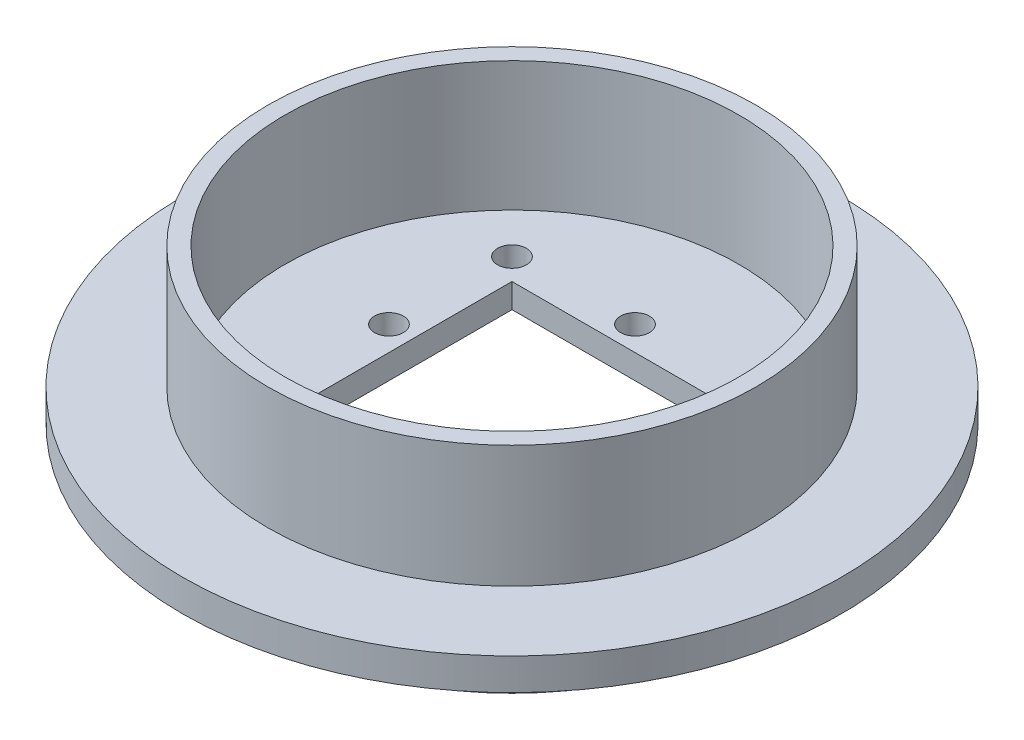
ISO-10303-21;
HEADER;
FILE_DESCRIPTION(('STEP AP214'),'2;1');
FILE_NAME('part.step','',(''),(''),'','','');
FILE_SCHEMA(('AUTOMOTIVE_DESIGN { 1 0 10303 214 1 1 1 1 }'));
ENDSEC;
DATA;
#1=APPLICATION_CONTEXT('core data for automotive mechanical design processes');
#2=APPLICATION_PROTOCOL_DEFINITION('international standard','automotive_design',2000,#1);
#3=PRODUCT_CONTEXT('',#1,'mechanical');
#4=PRODUCT('Part','Part','',(#3));
#5=PRODUCT_RELATED_PRODUCT_CATEGORY('part','',(#4));
#6=PRODUCT_DEFINITION_FORMATION('','',#4);
#7=PRODUCT_DEFINITION_CONTEXT('part definition',#1,'design');
#8=PRODUCT_DEFINITION('design','',#6,#7);
#9=PRODUCT_DEFINITION_SHAPE('','',#8);
#10=(LENGTH_UNIT() NAMED_UNIT(*) SI_UNIT(.MILLI.,.METRE.));
#11=(NAMED_UNIT(*) PLANE_ANGLE_UNIT() SI_UNIT($,.RADIAN.));
#12=(NAMED_UNIT(*) SI_UNIT($,.STERADIAN.) SOLID_ANGLE_UNIT());
#13=UNCERTAINTY_MEASURE_WITH_UNIT(LENGTH_MEASURE(1.E-05),#10,'distance_accuracy_value','');
#14=(GEOMETRIC_REPRESENTATION_CONTEXT(3) GLOBAL_UNCERTAINTY_ASSIGNED_CONTEXT((#13)) GLOBAL_UNIT_ASSIGNED_CONTEXT((#10,
#11,#12)) REPRESENTATION_CONTEXT('',''));
#15=CARTESIAN_POINT('',(0.,0.,0.));
#16=DIRECTION('',(0.,0.,1.));
#17=DIRECTION('',(1.,0.,0.));
#18=AXIS2_PLACEMENT_3D('',#15,#16,#17);
#19=CARTESIAN_POINT('',(-20.2,-6.,20.2));
#20=DIRECTION('',(-1.,0.,0.));
#21=DIRECTION('',(0.,0.,1.));
#22=AXIS2_PLACEMENT_3D('',#19,#20,#21);
#23=PLANE('',#22);
#24=DIRECTION('',(0.,0.,-1.));
#25=VECTOR('',#24,1.);
#26=CARTESIAN_POINT('',(-20.2,-1.,20.2));
#27=LINE('',#26,#25);
#28=CARTESIAN_POINT('',(-20.2,-1.,20.2));
#29=VERTEX_POINT('',#28);
#30=CARTESIAN_POINT('',(-20.2,-1.,-20.2));
#31=VERTEX_POINT('',#30);
#32=EDGE_CURVE('E102',#29,#31,#27,.T.);
#33=ORIENTED_EDGE('',*,*,#32,.F.);
#34=DIRECTION('',(0.,1.,0.));
#35=VECTOR('',#34,1.);
#36=CARTESIAN_POINT('',(-20.2,-6.,20.2));
#37=LINE('',#36,#35);
#38=CARTESIAN_POINT('',(-20.2,-6.,20.2));
#39=VERTEX_POINT('',#38);
#40=EDGE_CURVE('E100',#39,#29,#37,.T.);
#41=ORIENTED_EDGE('',*,*,#40,.F.);
#42=DIRECTION('',(0.,0.,-1.));
#43=VECTOR('',#42,1.);
#44=CARTESIAN_POINT('',(-20.2,-5.99999999999999,20.2));
#45=LINE('',#44,#43);
#46=CARTESIAN_POINT('',(-20.2,-6.,-20.2));
#47=VERTEX_POINT('',#46);
#48=EDGE_CURVE('E52',#39,#47,#45,.T.);
#49=ORIENTED_EDGE('',*,*,#48,.T.);
#50=DIRECTION('',(0.,1.,0.));
#51=VECTOR('',#50,1.);
#52=CARTESIAN_POINT('',(-20.2,-6.,-20.2));
#53=LINE('',#52,#51);
#54=EDGE_CURVE('E114',#47,#31,#53,.T.);
#55=ORIENTED_EDGE('',*,*,#54,.T.);
#56=EDGE_LOOP('',(#33,#41,#49,#55));
#57=FACE_BOUND('',#56,.T.);
#58=ADVANCED_FACE('F42',(#57),#23,.F.);
#59=CARTESIAN_POINT('',(-20.2,-6.,20.2));
#60=DIRECTION('',(0.,0.,1.));
#61=DIRECTION('',(1.,0.,0.));
#62=AXIS2_PLACEMENT_3D('',#59,#60,#61);
#63=PLANE('',#62);
#64=DIRECTION('',(-1.,0.,0.));
#65=VECTOR('',#64,1.);
#66=CARTESIAN_POINT('',(-20.2,-1.,20.2));
#67=LINE('',#66,#65);
#68=CARTESIAN_POINT('',(20.2,-1.,20.2));
#69=VERTEX_POINT('',#68);
#70=EDGE_CURVE('E85',#69,#29,#67,.T.);
#71=ORIENTED_EDGE('',*,*,#70,.F.);
#72=DIRECTION('',(0.,1.,0.));
#73=VECTOR('',#72,1.);
#74=CARTESIAN_POINT('',(20.2,-6.,20.2));
#75=LINE('',#74,#73);
#76=CARTESIAN_POINT('',(20.2,-6.,20.2));
#77=VERTEX_POINT('',#76);
#78=EDGE_CURVE('E98',#77,#69,#75,.T.);
#79=ORIENTED_EDGE('',*,*,#78,.F.);
#80=DIRECTION('',(-1.,0.,0.));
#81=VECTOR('',#80,1.);
#82=CARTESIAN_POINT('',(-20.2,-5.99999999999999,20.2));
#83=LINE('',#82,#81);
#84=EDGE_CURVE('E135',#77,#39,#83,.T.);
#85=ORIENTED_EDGE('',*,*,#84,.T.);
#86=ORIENTED_EDGE('',*,*,#40,.T.);
#87=EDGE_LOOP('',(#71,#79,#85,#86));
#88=FACE_BOUND('',#87,.T.);
#89=ADVANCED_FACE('F97',(#88),#63,.F.);
#90=CARTESIAN_POINT('',(-20.2,-6.,-20.2));
#91=DIRECTION('',(0.,0.,-1.));
#92=DIRECTION('',(-1.,0.,0.));
#93=AXIS2_PLACEMENT_3D('',#90,#91,#92);
#94=PLANE('',#93);
#95=DIRECTION('',(1.,0.,0.));
#96=VECTOR('',#95,1.);
#97=CARTESIAN_POINT('',(-20.2,-1.,-20.2));
#98=LINE('',#97,#96);
#99=CARTESIAN_POINT('',(20.2,-1.,-20.2));
#100=VERTEX_POINT('',#99);
#101=EDGE_CURVE('E59',#31,#100,#98,.T.);
#102=ORIENTED_EDGE('',*,*,#101,.F.);
#103=ORIENTED_EDGE('',*,*,#54,.F.);
#104=DIRECTION('',(1.,0.,0.));
#105=VECTOR('',#104,1.);
#106=CARTESIAN_POINT('',(-20.2,-5.99999999999999,-20.2));
#107=LINE('',#106,#105);
#108=CARTESIAN_POINT('',(20.2,-6.,-20.2));
#109=VERTEX_POINT('',#108);
#110=EDGE_CURVE('E132',#47,#109,#107,.T.);
#111=ORIENTED_EDGE('',*,*,#110,.T.);
#112=DIRECTION('',(0.,1.,0.));
#113=VECTOR('',#112,1.);
#114=CARTESIAN_POINT('',(20.2,-6.,-20.2));
#115=LINE('',#114,#113);
#116=EDGE_CURVE('E123',#109,#100,#115,.T.);
#117=ORIENTED_EDGE('',*,*,#116,.T.);
#118=EDGE_LOOP('',(#102,#103,#111,#117));
#119=FACE_BOUND('',#118,.T.);
#120=ADVANCED_FACE('F144',(#119),#94,.F.);
#121=CARTESIAN_POINT('',(20.2,-6.,20.2));
#122=DIRECTION('',(1.,0.,0.));
#123=DIRECTION('',(0.,0.,-1.));
#124=AXIS2_PLACEMENT_3D('',#121,#122,#123);
#125=PLANE('',#124);
#126=DIRECTION('',(0.,0.,1.));
#127=VECTOR('',#126,1.);
#128=CARTESIAN_POINT('',(20.2,-1.,20.2));
#129=LINE('',#128,#127);
#130=EDGE_CURVE('E82',#100,#69,#129,.T.);
#131=ORIENTED_EDGE('',*,*,#130,.F.);
#132=ORIENTED_EDGE('',*,*,#116,.F.);
#133=DIRECTION('',(0.,0.,1.));
#134=VECTOR('',#133,1.);
#135=CARTESIAN_POINT('',(20.2,-6.,20.2));
#136=LINE('',#135,#134);
#137=EDGE_CURVE('E106',#109,#77,#136,.T.);
#138=ORIENTED_EDGE('',*,*,#137,.T.);
#139=ORIENTED_EDGE('',*,*,#78,.T.);
#140=EDGE_LOOP('',(#131,#132,#138,#139));
#141=FACE_BOUND('',#140,.T.);
#142=ADVANCED_FACE('F104',(#141),#125,.F.);
#143=CARTESIAN_POINT('',(-24.6194173824159,-6.,-24.6194173824159));
#144=DIRECTION('',(0.,1.,0.));
#145=DIRECTION('',(0.,0.,1.));
#146=AXIS2_PLACEMENT_3D('',#143,#144,#145);
#147=CYLINDRICAL_SURFACE('',#146,2.95);
#148=CARTESIAN_POINT('',(-24.6194173824159,-6.,-24.6194173824159));
#149=DIRECTION('',(0.,1.,0.));
#150=DIRECTION('',(0.,0.,1.));
#151=AXIS2_PLACEMENT_3D('',#148,#149,#150);
#152=CIRCLE('',#151,2.95);
#153=CARTESIAN_POINT('',(-24.6194173824159,-6.,-21.6694173824159));
#154=VERTEX_POINT('',#153);
#155=EDGE_CURVE('E188',#154,#154,#152,.T.);
#156=ORIENTED_EDGE('',*,*,#155,.F.);
#157=EDGE_LOOP('',(#156));
#158=FACE_BOUND('',#157,.T.);
#159=CARTESIAN_POINT('',(-24.6194173824159,-1.,-24.6194173824159));
#160=DIRECTION('',(0.,1.,0.));
#161=DIRECTION('',(0.,0.,1.));
#162=AXIS2_PLACEMENT_3D('',#159,#160,#161);
#163=CIRCLE('',#162,2.95);
#164=CARTESIAN_POINT('',(-24.6194173824159,-1.,-21.6694173824159));
#165=VERTEX_POINT('',#164);
#166=EDGE_CURVE('E92',#165,#165,#163,.F.);
#167=ORIENTED_EDGE('',*,*,#166,.F.);
#168=EDGE_LOOP('',(#167));
#169=FACE_BOUND('',#168,.T.);
#170=ADVANCED_FACE('F235',(#158,#169),#147,.F.);
#171=CARTESIAN_POINT('',(-25.2,-6.,0.));
#172=DIRECTION('',(0.,1.,0.));
#173=DIRECTION('',(0.,0.,1.));
#174=AXIS2_PLACEMENT_3D('',#171,#172,#173);
#175=CYLINDRICAL_SURFACE('',#174,2.95);
#176=CARTESIAN_POINT('',(-25.2,-6.,0.));
#177=DIRECTION('',(0.,1.,0.));
#178=DIRECTION('',(0.,0.,1.));
#179=AXIS2_PLACEMENT_3D('',#176,#177,#178);
#180=CIRCLE('',#179,2.95);
#181=CARTESIAN_POINT('',(-25.2,-6.,2.95));
#182=VERTEX_POINT('',#181);
#183=EDGE_CURVE('E160',#182,#182,#180,.T.);
#184=ORIENTED_EDGE('',*,*,#183,.F.);
#185=EDGE_LOOP('',(#184));
#186=FACE_BOUND('',#185,.T.);
#187=CARTESIAN_POINT('',(-25.2,-1.,0.));
#188=DIRECTION('',(0.,1.,0.));
#189=DIRECTION('',(0.,0.,1.));
#190=AXIS2_PLACEMENT_3D('',#187,#188,#189);
#191=CIRCLE('',#190,2.95);
#192=CARTESIAN_POINT('',(-25.2,-1.,2.95));
#193=VERTEX_POINT('',#192);
#194=EDGE_CURVE('E297',#193,#193,#191,.F.);
#195=ORIENTED_EDGE('',*,*,#194,.F.);
#196=EDGE_LOOP('',(#195));
#197=FACE_BOUND('',#196,.T.);
#198=ADVANCED_FACE('F239',(#186,#197),#175,.F.);
#199=CARTESIAN_POINT('',(0.,-6.,-25.2));
#200=DIRECTION('',(0.,1.,0.));
#201=DIRECTION('',(0.,0.,1.));
#202=AXIS2_PLACEMENT_3D('',#199,#200,#201);
#203=CYLINDRICAL_SURFACE('',#202,2.95);
#204=CARTESIAN_POINT('',(0.,-6.,-25.2));
#205=DIRECTION('',(0.,1.,0.));
#206=DIRECTION('',(0.,0.,1.));
#207=AXIS2_PLACEMENT_3D('',#204,#205,#206);
#208=CIRCLE('',#207,2.95);
#209=CARTESIAN_POINT('',(0.,-6.,-22.25));
#210=VERTEX_POINT('',#209);
#211=EDGE_CURVE('E169',#210,#210,#208,.T.);
#212=ORIENTED_EDGE('',*,*,#211,.F.);
#213=EDGE_LOOP('',(#212));
#214=FACE_BOUND('',#213,.T.);
#215=CARTESIAN_POINT('',(0.,-1.,-25.2));
#216=DIRECTION('',(0.,1.,0.));
#217=DIRECTION('',(0.,0.,1.));
#218=AXIS2_PLACEMENT_3D('',#215,#216,#217);
#219=CIRCLE('',#218,2.95);
#220=CARTESIAN_POINT('',(0.,-1.,-22.25));
#221=VERTEX_POINT('',#220);
#222=EDGE_CURVE('E293',#221,#221,#219,.F.);
#223=ORIENTED_EDGE('',*,*,#222,.F.);
#224=EDGE_LOOP('',(#223));
#225=FACE_BOUND('',#224,.T.);
#226=ADVANCED_FACE('F245',(#214,#225),#203,.F.);
#227=CARTESIAN_POINT('',(0.,-6.,25.2));
#228=DIRECTION('',(0.,1.,0.));
#229=DIRECTION('',(0.,0.,1.));
#230=AXIS2_PLACEMENT_3D('',#227,#228,#229);
#231=CYLINDRICAL_SURFACE('',#230,2.95);
#232=CARTESIAN_POINT('',(0.,-6.,25.2));
#233=DIRECTION('',(0.,1.,0.));
#234=DIRECTION('',(0.,0.,1.));
#235=AXIS2_PLACEMENT_3D('',#232,#233,#234);
#236=CIRCLE('',#235,2.95);
#237=CARTESIAN_POINT('',(0.,-6.,28.15));
#238=VERTEX_POINT('',#237);
#239=EDGE_CURVE('E164',#238,#238,#236,.T.);
#240=ORIENTED_EDGE('',*,*,#239,.F.);
#241=EDGE_LOOP('',(#240));
#242=FACE_BOUND('',#241,.T.);
#243=CARTESIAN_POINT('',(0.,-1.,25.2));
#244=DIRECTION('',(0.,1.,0.));
#245=DIRECTION('',(0.,0.,1.));
#246=AXIS2_PLACEMENT_3D('',#243,#244,#245);
#247=CIRCLE('',#246,2.95);
#248=CARTESIAN_POINT('',(0.,-1.,28.15));
#249=VERTEX_POINT('',#248);
#250=EDGE_CURVE('E289',#249,#249,#247,.F.);
#251=ORIENTED_EDGE('',*,*,#250,.F.);
#252=EDGE_LOOP('',(#251));
#253=FACE_BOUND('',#252,.T.);
#254=ADVANCED_FACE('F336',(#242,#253),#231,.F.);
#255=CARTESIAN_POINT('',(24.6194173824159,-6.,-24.6194173824159));
#256=DIRECTION('',(0.,1.,0.));
#257=DIRECTION('',(0.,0.,1.));
#258=AXIS2_PLACEMENT_3D('',#255,#256,#257);
#259=CYLINDRICAL_SURFACE('',#258,2.95);
#260=CARTESIAN_POINT('',(24.6194173824159,-6.,-24.6194173824159));
#261=DIRECTION('',(0.,1.,0.));
#262=DIRECTION('',(0.,0.,1.));
#263=AXIS2_PLACEMENT_3D('',#260,#261,#262);
#264=CIRCLE('',#263,2.95);
#265=CARTESIAN_POINT('',(24.6194173824159,-6.,-21.6694173824159));
#266=VERTEX_POINT('',#265);
#267=EDGE_CURVE('E184',#266,#266,#264,.T.);
#268=ORIENTED_EDGE('',*,*,#267,.F.);
#269=EDGE_LOOP('',(#268));
#270=FACE_BOUND('',#269,.T.);
#271=CARTESIAN_POINT('',(24.6194173824159,-1.,-24.6194173824159));
#272=DIRECTION('',(0.,1.,0.));
#273=DIRECTION('',(0.,0.,1.));
#274=AXIS2_PLACEMENT_3D('',#271,#272,#273);
#275=CIRCLE('',#274,2.95);
#276=CARTESIAN_POINT('',(24.6194173824159,-1.,-21.6694173824159));
#277=VERTEX_POINT('',#276);
#278=EDGE_CURVE('E285',#277,#277,#275,.F.);
#279=ORIENTED_EDGE('',*,*,#278,.F.);
#280=EDGE_LOOP('',(#279));
#281=FACE_BOUND('',#280,.T.);
#282=ADVANCED_FACE('F334',(#270,#281),#259,.F.);
#283=CARTESIAN_POINT('',(-24.6194173824159,-6.,24.6194173824159));
#284=DIRECTION('',(0.,1.,0.));
#285=DIRECTION('',(0.,0.,1.));
#286=AXIS2_PLACEMENT_3D('',#283,#284,#285);
#287=CYLINDRICAL_SURFACE('',#286,2.95);
#288=CARTESIAN_POINT('',(-24.6194173824159,-6.,24.6194173824159));
#289=DIRECTION('',(0.,1.,0.));
#290=DIRECTION('',(0.,0.,1.));
#291=AXIS2_PLACEMENT_3D('',#288,#289,#290);
#292=CIRCLE('',#291,2.95);
#293=CARTESIAN_POINT('',(-24.6194173824159,-6.,27.5694173824159));
#294=VERTEX_POINT('',#293);
#295=EDGE_CURVE('E180',#294,#294,#292,.T.);
#296=ORIENTED_EDGE('',*,*,#295,.F.);
#297=EDGE_LOOP('',(#296));
#298=FACE_BOUND('',#297,.T.);
#299=CARTESIAN_POINT('',(-24.6194173824159,-1.,24.6194173824159));
#300=DIRECTION('',(0.,1.,0.));
#301=DIRECTION('',(0.,0.,1.));
#302=AXIS2_PLACEMENT_3D('',#299,#300,#301);
#303=CIRCLE('',#302,2.95);
#304=CARTESIAN_POINT('',(-24.6194173824159,-1.,27.5694173824159));
#305=VERTEX_POINT('',#304);
#306=EDGE_CURVE('E281',#305,#305,#303,.F.);
#307=ORIENTED_EDGE('',*,*,#306,.F.);
#308=EDGE_LOOP('',(#307));
#309=FACE_BOUND('',#308,.T.);
#310=ADVANCED_FACE('F252',(#298,#309),#287,.F.);
#311=CARTESIAN_POINT('',(24.6194173824159,-6.,24.6194173824159));
#312=DIRECTION('',(0.,1.,0.));
#313=DIRECTION('',(0.,0.,1.));
#314=AXIS2_PLACEMENT_3D('',#311,#312,#313);
#315=CYLINDRICAL_SURFACE('',#314,2.95);
#316=CARTESIAN_POINT('',(24.6194173824159,-6.,24.6194173824159));
#317=DIRECTION('',(0.,1.,0.));
#318=DIRECTION('',(0.,0.,1.));
#319=AXIS2_PLACEMENT_3D('',#316,#317,#318);
#320=CIRCLE('',#319,2.95);
#321=CARTESIAN_POINT('',(24.6194173824159,-6.,27.5694173824159));
#322=VERTEX_POINT('',#321);
#323=EDGE_CURVE('E176',#322,#322,#320,.T.);
#324=ORIENTED_EDGE('',*,*,#323,.F.);
#325=EDGE_LOOP('',(#324));
#326=FACE_BOUND('',#325,.T.);
#327=CARTESIAN_POINT('',(24.6194173824159,-1.,24.6194173824159));
#328=DIRECTION('',(0.,1.,0.));
#329=DIRECTION('',(0.,0.,1.));
#330=AXIS2_PLACEMENT_3D('',#327,#328,#329);
#331=CIRCLE('',#330,2.95);
#332=CARTESIAN_POINT('',(24.6194173824159,-1.,27.5694173824159));
#333=VERTEX_POINT('',#332);
#334=EDGE_CURVE('E276',#333,#333,#331,.F.);
#335=ORIENTED_EDGE('',*,*,#334,.F.);
#336=EDGE_LOOP('',(#335));
#337=FACE_BOUND('',#336,.T.);
#338=ADVANCED_FACE('F324',(#326,#337),#315,.F.);
#339=CARTESIAN_POINT('',(25.2,-6.,0.));
#340=DIRECTION('',(0.,1.,0.));
#341=DIRECTION('',(0.,0.,1.));
#342=AXIS2_PLACEMENT_3D('',#339,#340,#341);
#343=CYLINDRICAL_SURFACE('',#342,2.95);
#344=CARTESIAN_POINT('',(25.2,-6.,0.));
#345=DIRECTION('',(0.,1.,0.));
#346=DIRECTION('',(0.,0.,1.));
#347=AXIS2_PLACEMENT_3D('',#344,#345,#346);
#348=CIRCLE('',#347,2.95);
#349=CARTESIAN_POINT('',(25.2,-6.,2.95));
#350=VERTEX_POINT('',#349);
#351=EDGE_CURVE('E168',#350,#350,#348,.T.);
#352=ORIENTED_EDGE('',*,*,#351,.F.);
#353=EDGE_LOOP('',(#352));
#354=FACE_BOUND('',#353,.T.);
#355=CARTESIAN_POINT('',(25.2,-1.,0.));
#356=DIRECTION('',(0.,1.,0.));
#357=DIRECTION('',(0.,0.,1.));
#358=AXIS2_PLACEMENT_3D('',#355,#356,#357);
#359=CIRCLE('',#358,2.95);
#360=CARTESIAN_POINT('',(25.2,-1.,2.95));
#361=VERTEX_POINT('',#360);
#362=EDGE_CURVE('E46',#361,#361,#359,.F.);
#363=ORIENTED_EDGE('',*,*,#362,.F.);
#364=EDGE_LOOP('',(#363));
#365=FACE_BOUND('',#364,.T.);
#366=ADVANCED_FACE('F322',(#354,#365),#343,.F.);
#367=CARTESIAN_POINT('',(0.,-6.,0.));
#368=DIRECTION('',(0.,-1.,0.));
#369=DIRECTION('',(0.,0.,-1.));
#370=AXIS2_PLACEMENT_3D('',#367,#368,#369);
#371=PLANE('',#370);
#372=ORIENTED_EDGE('',*,*,#84,.F.);
#373=ORIENTED_EDGE('',*,*,#137,.F.);
#374=ORIENTED_EDGE('',*,*,#110,.F.);
#375=ORIENTED_EDGE('',*,*,#48,.F.);
#376=EDGE_LOOP('',(#372,#373,#374,#375));
#377=FACE_BOUND('',#376,.T.);
#378=ORIENTED_EDGE('',*,*,#155,.T.);
#379=EDGE_LOOP('',(#378));
#380=FACE_BOUND('',#379,.T.);
#381=ORIENTED_EDGE('',*,*,#183,.T.);
#382=EDGE_LOOP('',(#381));
#383=FACE_BOUND('',#382,.T.);
#384=ORIENTED_EDGE('',*,*,#211,.T.);
#385=EDGE_LOOP('',(#384));
#386=FACE_BOUND('',#385,.T.);
#387=ORIENTED_EDGE('',*,*,#239,.T.);
#388=EDGE_LOOP('',(#387));
#389=FACE_BOUND('',#388,.T.);
#390=ORIENTED_EDGE('',*,*,#267,.T.);
#391=EDGE_LOOP('',(#390));
#392=FACE_BOUND('',#391,.T.);
#393=ORIENTED_EDGE('',*,*,#295,.T.);
#394=EDGE_LOOP('',(#393));
#395=FACE_BOUND('',#394,.T.);
#396=ORIENTED_EDGE('',*,*,#323,.T.);
#397=EDGE_LOOP('',(#396));
#398=FACE_BOUND('',#397,.T.);
#399=ORIENTED_EDGE('',*,*,#351,.T.);
#400=EDGE_LOOP('',(#399));
#401=FACE_BOUND('',#400,.T.);
#402=CARTESIAN_POINT('',(0.,-6.,0.));
#403=DIRECTION('',(0.,-1.,0.));
#404=DIRECTION('',(0.,0.,-1.));
#405=AXIS2_PLACEMENT_3D('',#402,#403,#404);
#406=CIRCLE('',#405,46.5);
#407=CARTESIAN_POINT('',(0.,-6.,-46.5));
#408=VERTEX_POINT('',#407);
#409=EDGE_CURVE('E11',#408,#408,#406,.F.);
#410=ORIENTED_EDGE('',*,*,#409,.F.);
#411=EDGE_LOOP('',(#410));
#412=FACE_BOUND('',#411,.T.);
#413=ADVANCED_FACE('F141',(#377,#380,#383,#386,#389,#392,#395,#398,#401,#412),#371,.T.);
#414=CARTESIAN_POINT('',(0.,25.5,0.));
#415=DIRECTION('',(0.,1.,0.));
#416=DIRECTION('',(0.,0.,1.));
#417=AXIS2_PLACEMENT_3D('',#414,#415,#416);
#418=PLANE('',#417);
#419=CARTESIAN_POINT('',(0.,25.5,0.));
#420=DIRECTION('',(0.,1.,0.));
#421=DIRECTION('',(0.,0.,1.));
#422=AXIS2_PLACEMENT_3D('',#419,#420,#421);
#423=CIRCLE('',#422,50.);
#424=CARTESIAN_POINT('',(0.,25.5,50.));
#425=VERTEX_POINT('',#424);
#426=EDGE_CURVE('E198',#425,#425,#423,.T.);
#427=ORIENTED_EDGE('',*,*,#426,.T.);
#428=EDGE_LOOP('',(#427));
#429=FACE_BOUND('',#428,.T.);
#430=CARTESIAN_POINT('',(0.,25.5,0.));
#431=DIRECTION('',(0.,1.,0.));
#432=DIRECTION('',(0.,0.,1.));
#433=AXIS2_PLACEMENT_3D('',#430,#431,#432);
#434=CIRCLE('',#433,46.5);
#435=CARTESIAN_POINT('',(0.,25.5,46.5));
#436=VERTEX_POINT('',#435);
#437=EDGE_CURVE('E195',#436,#436,#434,.T.);
#438=ORIENTED_EDGE('',*,*,#437,.F.);
#439=EDGE_LOOP('',(#438));
#440=FACE_BOUND('',#439,.T.);
#441=ADVANCED_FACE('F254',(#429,#440),#418,.T.);
#442=CARTESIAN_POINT('',(0.,41.,0.));
#443=DIRECTION('',(0.,-1.,0.));
#444=DIRECTION('',(0.,0.,-1.));
#445=AXIS2_PLACEMENT_3D('',#442,#443,#444);
#446=CYLINDRICAL_SURFACE('',#445,46.5);
#447=ORIENTED_EDGE('',*,*,#437,.T.);
#448=EDGE_LOOP('',(#447));
#449=FACE_BOUND('',#448,.T.);
#450=CARTESIAN_POINT('',(0.,-1.,0.));
#451=DIRECTION('',(0.,1.,0.));
#452=DIRECTION('',(0.,0.,1.));
#453=AXIS2_PLACEMENT_3D('',#450,#451,#452);
#454=CIRCLE('',#453,46.5);
#455=CARTESIAN_POINT('',(0.,-1.,46.5));
#456=VERTEX_POINT('',#455);
#457=EDGE_CURVE('E270',#456,#456,#454,.T.);
#458=ORIENTED_EDGE('',*,*,#457,.F.);
#459=EDGE_LOOP('',(#458));
#460=FACE_BOUND('',#459,.T.);
#461=ADVANCED_FACE('F44',(#449,#460),#446,.F.);
#462=CARTESIAN_POINT('',(0.,-146.663996924429,0.));
#463=DIRECTION('',(0.,1.,0.));
#464=DIRECTION('',(0.,0.,1.));
#465=AXIS2_PLACEMENT_3D('',#462,#463,#464);
#466=CYLINDRICAL_SURFACE('',#465,50.);
#467=CARTESIAN_POINT('',(0.,0.5,0.));
#468=DIRECTION('',(0.,1.,0.));
#469=DIRECTION('',(0.,0.,1.));
#470=AXIS2_PLACEMENT_3D('',#467,#468,#469);
#471=CIRCLE('',#470,50.);
#472=CARTESIAN_POINT('',(0.,0.5,50.));
#473=VERTEX_POINT('',#472);
#474=EDGE_CURVE('E108',#473,#473,#471,.F.);
#475=ORIENTED_EDGE('',*,*,#474,.F.);
#476=EDGE_LOOP('',(#475));
#477=FACE_BOUND('',#476,.T.);
#478=ORIENTED_EDGE('',*,*,#426,.F.);
#479=EDGE_LOOP('',(#478));
#480=FACE_BOUND('',#479,.T.);
#481=ADVANCED_FACE('F222',(#477,#480),#466,.T.);
#482=CARTESIAN_POINT('',(0.,0.5,0.));
#483=DIRECTION('',(0.,1.,0.));
#484=DIRECTION('',(0.,0.,1.));
#485=AXIS2_PLACEMENT_3D('',#482,#483,#484);
#486=PLANE('',#485);
#487=CARTESIAN_POINT('',(0.,0.5,0.));
#488=DIRECTION('',(0.,1.,0.));
#489=DIRECTION('',(0.,0.,1.));
#490=AXIS2_PLACEMENT_3D('',#487,#488,#489);
#491=CIRCLE('',#490,67.5);
#492=CARTESIAN_POINT('',(0.,0.5,67.5));
#493=VERTEX_POINT('',#492);
#494=EDGE_CURVE('E117',#493,#493,#491,.T.);
#495=ORIENTED_EDGE('',*,*,#494,.T.);
#496=EDGE_LOOP('',(#495));
#497=FACE_BOUND('',#496,.T.);
#498=ORIENTED_EDGE('',*,*,#474,.T.);
#499=EDGE_LOOP('',(#498));
#500=FACE_BOUND('',#499,.T.);
#501=ADVANCED_FACE('F207',(#497,#500),#486,.T.);
#502=CARTESIAN_POINT('',(0.,-15.,0.));
#503=DIRECTION('',(0.,1.,0.));
#504=DIRECTION('',(0.,0.,1.));
#505=AXIS2_PLACEMENT_3D('',#502,#503,#504);
#506=CYLINDRICAL_SURFACE('',#505,67.5);
#507=CARTESIAN_POINT('',(0.,-6.,0.));
#508=DIRECTION('',(0.,-1.,0.));
#509=DIRECTION('',(0.,0.,-1.));
#510=AXIS2_PLACEMENT_3D('',#507,#508,#509);
#511=CIRCLE('',#510,67.5);
#512=CARTESIAN_POINT('',(0.,-6.,-67.5));
#513=VERTEX_POINT('',#512);
#514=EDGE_CURVE('E126',#513,#513,#511,.T.);
#515=ORIENTED_EDGE('',*,*,#514,.F.);
#516=EDGE_LOOP('',(#515));
#517=FACE_BOUND('',#516,.T.);
#518=ORIENTED_EDGE('',*,*,#494,.F.);
#519=EDGE_LOOP('',(#518));
#520=FACE_BOUND('',#519,.T.);
#521=ADVANCED_FACE('F210',(#517,#520),#506,.T.);
#522=CARTESIAN_POINT('',(0.,-6.,0.));
#523=DIRECTION('',(0.,-1.,0.));
#524=DIRECTION('',(0.,0.,-1.));
#525=AXIS2_PLACEMENT_3D('',#522,#523,#524);
#526=CIRCLE('',#525,50.);
#527=CARTESIAN_POINT('',(0.,-6.,-50.));
#528=VERTEX_POINT('',#527);
#529=EDGE_CURVE('E155',#528,#528,#526,.T.);
#530=ORIENTED_EDGE('',*,*,#529,.F.);
#531=EDGE_LOOP('',(#530));
#532=FACE_BOUND('',#531,.T.);
#533=ORIENTED_EDGE('',*,*,#514,.T.);
#534=EDGE_LOOP('',(#533));
#535=FACE_BOUND('',#534,.T.);
#536=ADVANCED_FACE('F212',(#532,#535),#371,.T.);
#537=CARTESIAN_POINT('',(0.,-18.5,0.));
#538=DIRECTION('',(0.,-1.,0.));
#539=DIRECTION('',(0.,0.,-1.));
#540=AXIS2_PLACEMENT_3D('',#537,#538,#539);
#541=PLANE('',#540);
#542=CARTESIAN_POINT('',(0.,-18.5,0.));
#543=DIRECTION('',(0.,-1.,0.));
#544=DIRECTION('',(0.,0.,-1.));
#545=AXIS2_PLACEMENT_3D('',#542,#543,#544);
#546=CIRCLE('',#545,50.);
#547=CARTESIAN_POINT('',(0.,-18.5,-50.));
#548=VERTEX_POINT('',#547);
#549=EDGE_CURVE('E156',#548,#548,#546,.T.);
#550=ORIENTED_EDGE('',*,*,#549,.T.);
#551=EDGE_LOOP('',(#550));
#552=FACE_BOUND('',#551,.T.);
#553=CARTESIAN_POINT('',(0.,-18.5,0.));
#554=DIRECTION('',(0.,-1.,0.));
#555=DIRECTION('',(0.,0.,-1.));
#556=AXIS2_PLACEMENT_3D('',#553,#554,#555);
#557=CIRCLE('',#556,46.5);
#558=CARTESIAN_POINT('',(0.,-18.5,-46.5));
#559=VERTEX_POINT('',#558);
#560=EDGE_CURVE('E151',#559,#559,#557,.T.);
#561=ORIENTED_EDGE('',*,*,#560,.F.);
#562=EDGE_LOOP('',(#561));
#563=FACE_BOUND('',#562,.T.);
#564=ADVANCED_FACE('F219',(#552,#563),#541,.T.);
#565=CARTESIAN_POINT('',(0.,-18.5,0.));
#566=DIRECTION('',(0.,1.,0.));
#567=DIRECTION('',(0.,0.,1.));
#568=AXIS2_PLACEMENT_3D('',#565,#566,#567);
#569=CYLINDRICAL_SURFACE('',#568,50.);
#570=ORIENTED_EDGE('',*,*,#549,.F.);
#571=EDGE_LOOP('',(#570));
#572=FACE_BOUND('',#571,.T.);
#573=ORIENTED_EDGE('',*,*,#529,.T.);
#574=EDGE_LOOP('',(#573));
#575=FACE_BOUND('',#574,.T.);
#576=ADVANCED_FACE('F357',(#572,#575),#569,.T.);
#577=CARTESIAN_POINT('',(0.,-18.5,0.));
#578=DIRECTION('',(0.,1.,0.));
#579=DIRECTION('',(0.,0.,1.));
#580=AXIS2_PLACEMENT_3D('',#577,#578,#579);
#581=CYLINDRICAL_SURFACE('',#580,46.5);
#582=ORIENTED_EDGE('',*,*,#560,.T.);
#583=EDGE_LOOP('',(#582));
#584=FACE_BOUND('',#583,.T.);
#585=ORIENTED_EDGE('',*,*,#409,.T.);
#586=EDGE_LOOP('',(#585));
#587=FACE_BOUND('',#586,.T.);
#588=ADVANCED_FACE('F306',(#584,#587),#581,.F.);
#589=CARTESIAN_POINT('',(0.,-1.,0.));
#590=DIRECTION('',(0.,1.,0.));
#591=DIRECTION('',(0.,0.,1.));
#592=AXIS2_PLACEMENT_3D('',#589,#590,#591);
#593=PLANE('',#592);
#594=ORIENTED_EDGE('',*,*,#166,.T.);
#595=EDGE_LOOP('',(#594));
#596=FACE_BOUND('',#595,.T.);
#597=ORIENTED_EDGE('',*,*,#194,.T.);
#598=EDGE_LOOP('',(#597));
#599=FACE_BOUND('',#598,.T.);
#600=ORIENTED_EDGE('',*,*,#222,.T.);
#601=EDGE_LOOP('',(#600));
#602=FACE_BOUND('',#601,.T.);
#603=ORIENTED_EDGE('',*,*,#250,.T.);
#604=EDGE_LOOP('',(#603));
#605=FACE_BOUND('',#604,.T.);
#606=ORIENTED_EDGE('',*,*,#278,.T.);
#607=EDGE_LOOP('',(#606));
#608=FACE_BOUND('',#607,.T.);
#609=ORIENTED_EDGE('',*,*,#306,.T.);
#610=EDGE_LOOP('',(#609));
#611=FACE_BOUND('',#610,.T.);
#612=ORIENTED_EDGE('',*,*,#334,.T.);
#613=EDGE_LOOP('',(#612));
#614=FACE_BOUND('',#613,.T.);
#615=ORIENTED_EDGE('',*,*,#362,.T.);
#616=EDGE_LOOP('',(#615));
#617=FACE_BOUND('',#616,.T.);
#618=ORIENTED_EDGE('',*,*,#457,.T.);
#619=EDGE_LOOP('',(#618));
#620=FACE_BOUND('',#619,.T.);
#621=ORIENTED_EDGE('',*,*,#32,.T.);
#622=ORIENTED_EDGE('',*,*,#101,.T.);
#623=ORIENTED_EDGE('',*,*,#130,.T.);
#624=ORIENTED_EDGE('',*,*,#70,.T.);
#625=EDGE_LOOP('',(#621,#622,#623,#624));
#626=FACE_BOUND('',#625,.T.);
#627=ADVANCED_FACE('F84',(#596,#599,#602,#605,#608,#611,#614,#617,#620,#626),#593,.T.);
#628=CLOSED_SHELL('',(#58,#89,#120,#142,#170,#198,#226,#254,#282,#310,#338,#366,#413,#441,#461,
#481,#501,#521,#536,#564,#576,#588,#627));
#629=MANIFOLD_SOLID_BREP('B2',#628);
#630=ADVANCED_BREP_SHAPE_REPRESENTATION('',(#18,#629),#14);
#631=SHAPE_DEFINITION_REPRESENTATION(#9,#630);
ENDSEC;
END-ISO-10303-21;
